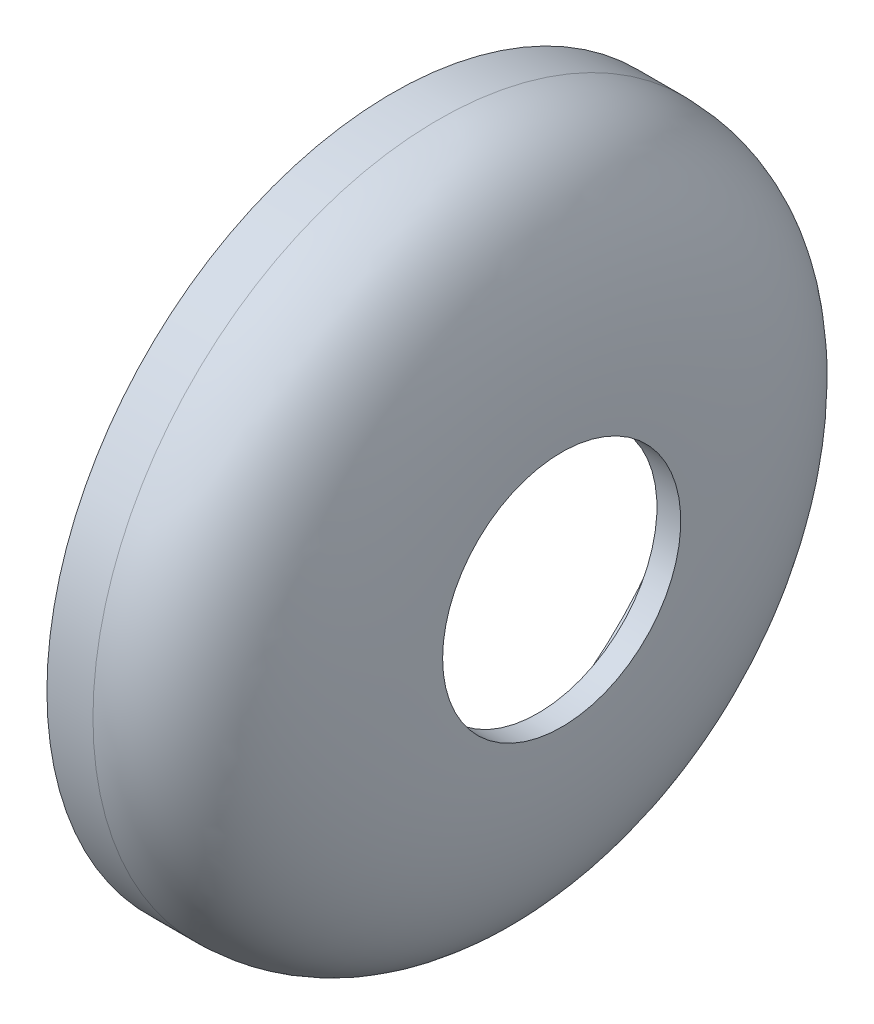
ISO-10303-21;
HEADER;
FILE_DESCRIPTION(('STEP AP214'),'2;1');
FILE_NAME('part.step','',(''),(''),'','','');
FILE_SCHEMA(('AUTOMOTIVE_DESIGN { 1 0 10303 214 1 1 1 1 }'));
ENDSEC;
DATA;
#1=APPLICATION_CONTEXT('core data for automotive mechanical design processes');
#2=APPLICATION_PROTOCOL_DEFINITION('international standard','automotive_design',2000,#1);
#3=PRODUCT_CONTEXT('',#1,'mechanical');
#4=PRODUCT('Part','Part','',(#3));
#5=PRODUCT_RELATED_PRODUCT_CATEGORY('part','',(#4));
#6=PRODUCT_DEFINITION_FORMATION('','',#4);
#7=PRODUCT_DEFINITION_CONTEXT('part definition',#1,'design');
#8=PRODUCT_DEFINITION('design','',#6,#7);
#9=PRODUCT_DEFINITION_SHAPE('','',#8);
#10=(LENGTH_UNIT() NAMED_UNIT(*) SI_UNIT(.MILLI.,.METRE.));
#11=(NAMED_UNIT(*) PLANE_ANGLE_UNIT() SI_UNIT($,.RADIAN.));
#12=(NAMED_UNIT(*) SI_UNIT($,.STERADIAN.) SOLID_ANGLE_UNIT());
#13=UNCERTAINTY_MEASURE_WITH_UNIT(LENGTH_MEASURE(1.E-05),#10,'distance_accuracy_value','');
#14=(GEOMETRIC_REPRESENTATION_CONTEXT(3) GLOBAL_UNCERTAINTY_ASSIGNED_CONTEXT((#13)) GLOBAL_UNIT_ASSIGNED_CONTEXT((#10,
#11,#12)) REPRESENTATION_CONTEXT('',''));
#15=CARTESIAN_POINT('',(0.,0.,0.));
#16=DIRECTION('',(0.,0.,1.));
#17=DIRECTION('',(1.,0.,0.));
#18=AXIS2_PLACEMENT_3D('',#15,#16,#17);
#19=CARTESIAN_POINT('',(-5.32730087399354,0.,0.));
#20=DIRECTION('',(-1.,0.,0.));
#21=DIRECTION('',(0.,0.,1.));
#22=AXIS2_PLACEMENT_3D('',#19,#20,#21);
#23=CYLINDRICAL_SURFACE('',#22,27.);
#24=CARTESIAN_POINT('',(3.86553223236098,0.,0.));
#25=DIRECTION('',(-1.,0.,0.));
#26=DIRECTION('',(0.,0.,1.));
#27=AXIS2_PLACEMENT_3D('',#24,#25,#26);
#28=CIRCLE('',#27,27.);
#29=CARTESIAN_POINT('',(3.86553223236098,0.,27.));
#30=VERTEX_POINT('',#29);
#31=EDGE_CURVE('E10',#30,#30,#28,.T.);
#32=ORIENTED_EDGE('',*,*,#31,.F.);
#33=EDGE_LOOP('',(#32));
#34=FACE_BOUND('',#33,.T.);
#35=CARTESIAN_POINT('',(0.,0.,0.));
#36=DIRECTION('',(-1.,0.,0.));
#37=DIRECTION('',(0.,0.,1.));
#38=AXIS2_PLACEMENT_3D('',#35,#36,#37);
#39=CIRCLE('',#38,27.);
#40=CARTESIAN_POINT('',(0.,0.,27.));
#41=VERTEX_POINT('',#40);
#42=EDGE_CURVE('E64',#41,#41,#39,.T.);
#43=ORIENTED_EDGE('',*,*,#42,.T.);
#44=EDGE_LOOP('',(#43));
#45=FACE_BOUND('',#44,.T.);
#46=ADVANCED_FACE('F37',(#34,#45),#23,.F.);
#47=CARTESIAN_POINT('',(3.86553223236098,27.,0.));
#48=CARTESIAN_POINT('',(12.23,27.,0.));
#49=CARTESIAN_POINT('',(12.23,10.,0.));
#50=B_SPLINE_CURVE_WITH_KNOTS('',2,(#47,#48,#49),.UNSPECIFIED.,.F.,.F.,(3,3),(0.,1.),.UNSPECIFIED.);
#51=CARTESIAN_POINT('',(-5.32730087399354,0.,0.));
#52=DIRECTION('',(-1.,0.,0.));
#53=AXIS1_PLACEMENT('',#51,#52);
#54=SURFACE_OF_REVOLUTION('',#50,#53);
#55=CARTESIAN_POINT('',(12.23,0.,0.));
#56=DIRECTION('',(-1.,0.,0.));
#57=DIRECTION('',(0.,0.,1.));
#58=AXIS2_PLACEMENT_3D('',#55,#56,#57);
#59=CIRCLE('',#58,10.);
#60=CARTESIAN_POINT('',(12.23,0.,10.));
#61=VERTEX_POINT('',#60);
#62=EDGE_CURVE('E44',#61,#61,#59,.T.);
#63=ORIENTED_EDGE('',*,*,#62,.F.);
#64=EDGE_LOOP('',(#63));
#65=FACE_BOUND('',#64,.T.);
#66=ORIENTED_EDGE('',*,*,#31,.T.);
#67=EDGE_LOOP('',(#66));
#68=FACE_BOUND('',#67,.T.);
#69=ADVANCED_FACE('F88',(#65,#68),#54,.T.);
#70=CARTESIAN_POINT('',(-5.32730087399354,0.,0.));
#71=DIRECTION('',(-1.,0.,0.));
#72=DIRECTION('',(0.,0.,1.));
#73=AXIS2_PLACEMENT_3D('',#70,#71,#72);
#74=CYLINDRICAL_SURFACE('',#73,10.);
#75=CARTESIAN_POINT('',(14.23,0.,0.));
#76=DIRECTION('',(-1.,0.,0.));
#77=DIRECTION('',(0.,0.,1.));
#78=AXIS2_PLACEMENT_3D('',#75,#76,#77);
#79=CIRCLE('',#78,10.);
#80=CARTESIAN_POINT('',(14.23,0.,10.));
#81=VERTEX_POINT('',#80);
#82=EDGE_CURVE('E49',#81,#81,#79,.T.);
#83=ORIENTED_EDGE('',*,*,#82,.F.);
#84=EDGE_LOOP('',(#83));
#85=FACE_BOUND('',#84,.T.);
#86=ORIENTED_EDGE('',*,*,#62,.T.);
#87=EDGE_LOOP('',(#86));
#88=FACE_BOUND('',#87,.T.);
#89=ADVANCED_FACE('F84',(#85,#88),#74,.F.);
#90=CARTESIAN_POINT('',(14.23,10.,0.));
#91=CARTESIAN_POINT('',(14.23,29.,0.));
#92=CARTESIAN_POINT('',(3.86553223236098,29.,0.));
#93=B_SPLINE_CURVE_WITH_KNOTS('',2,(#90,#91,#92),.UNSPECIFIED.,.F.,.F.,(3,3),(0.,1.),.UNSPECIFIED.);
#94=CARTESIAN_POINT('',(-5.32730087399354,0.,0.));
#95=DIRECTION('',(-1.,0.,0.));
#96=AXIS1_PLACEMENT('',#94,#95);
#97=SURFACE_OF_REVOLUTION('',#93,#96);
#98=CARTESIAN_POINT('',(3.86553223236098,0.,0.));
#99=DIRECTION('',(-1.,0.,0.));
#100=DIRECTION('',(0.,0.,1.));
#101=AXIS2_PLACEMENT_3D('',#98,#99,#100);
#102=CIRCLE('',#101,29.);
#103=CARTESIAN_POINT('',(3.86553223236098,0.,29.));
#104=VERTEX_POINT('',#103);
#105=EDGE_CURVE('E54',#104,#104,#102,.T.);
#106=ORIENTED_EDGE('',*,*,#105,.F.);
#107=EDGE_LOOP('',(#106));
#108=FACE_BOUND('',#107,.T.);
#109=ORIENTED_EDGE('',*,*,#82,.T.);
#110=EDGE_LOOP('',(#109));
#111=FACE_BOUND('',#110,.T.);
#112=ADVANCED_FACE('F79',(#108,#111),#97,.T.);
#113=CARTESIAN_POINT('',(-5.32730087399354,0.,0.));
#114=DIRECTION('',(-1.,0.,0.));
#115=DIRECTION('',(0.,0.,1.));
#116=AXIS2_PLACEMENT_3D('',#113,#114,#115);
#117=CYLINDRICAL_SURFACE('',#116,29.);
#118=CARTESIAN_POINT('',(0.,0.,0.));
#119=DIRECTION('',(-1.,0.,0.));
#120=DIRECTION('',(0.,0.,1.));
#121=AXIS2_PLACEMENT_3D('',#118,#119,#120);
#122=CIRCLE('',#121,29.);
#123=CARTESIAN_POINT('',(0.,0.,29.));
#124=VERTEX_POINT('',#123);
#125=EDGE_CURVE('E60',#124,#124,#122,.T.);
#126=ORIENTED_EDGE('',*,*,#125,.F.);
#127=EDGE_LOOP('',(#126));
#128=FACE_BOUND('',#127,.T.);
#129=ORIENTED_EDGE('',*,*,#105,.T.);
#130=EDGE_LOOP('',(#129));
#131=FACE_BOUND('',#130,.T.);
#132=ADVANCED_FACE('F83',(#128,#131),#117,.T.);
#133=CARTESIAN_POINT('',(0.,27.,0.));
#134=DIRECTION('',(1.,0.,0.));
#135=DIRECTION('',(0.,0.,-1.));
#136=AXIS2_PLACEMENT_3D('',#133,#134,#135);
#137=PLANE('',#136);
#138=ORIENTED_EDGE('',*,*,#42,.F.);
#139=EDGE_LOOP('',(#138));
#140=FACE_BOUND('',#139,.T.);
#141=ORIENTED_EDGE('',*,*,#125,.T.);
#142=EDGE_LOOP('',(#141));
#143=FACE_BOUND('',#142,.T.);
#144=ADVANCED_FACE('F101',(#140,#143),#137,.F.);
#145=CLOSED_SHELL('',(#46,#69,#89,#112,#132,#144));
#146=MANIFOLD_SOLID_BREP('B2',#145);
#147=ADVANCED_BREP_SHAPE_REPRESENTATION('',(#18,#146),#14);
#148=SHAPE_DEFINITION_REPRESENTATION(#9,#147);
ENDSEC;
END-ISO-10303-21;
